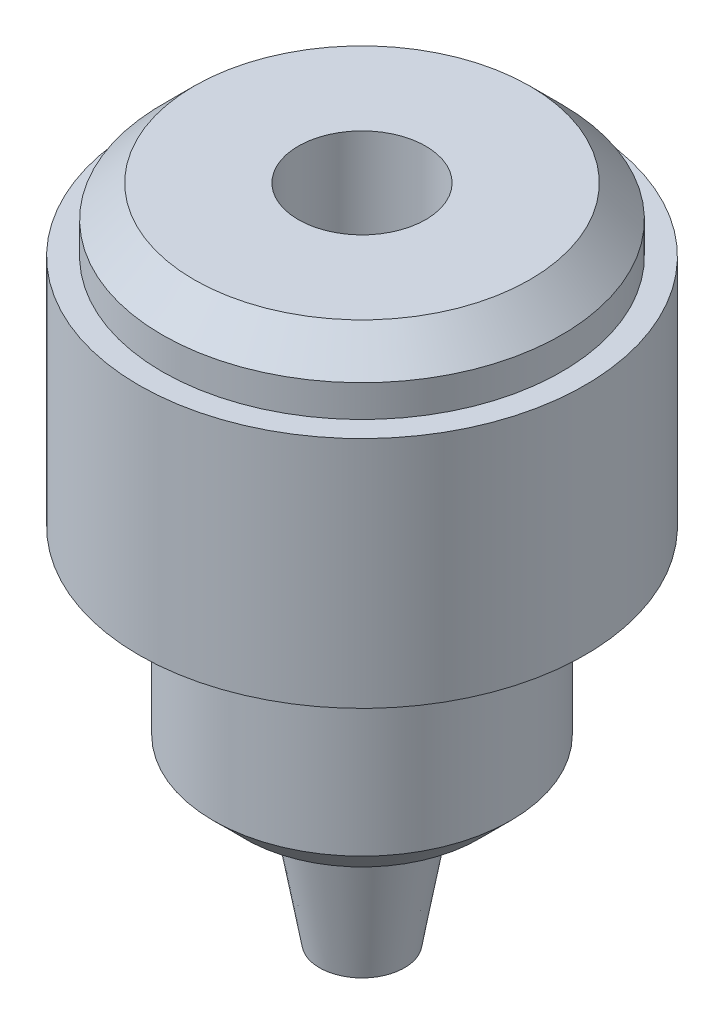
ISO-10303-21;
HEADER;
FILE_DESCRIPTION(('STEP AP214'),'2;1');
FILE_NAME('part.step','',(''),(''),'','','');
FILE_SCHEMA(('AUTOMOTIVE_DESIGN { 1 0 10303 214 1 1 1 1 }'));
ENDSEC;
DATA;
#1=APPLICATION_CONTEXT('core data for automotive mechanical design processes');
#2=APPLICATION_PROTOCOL_DEFINITION('international standard','automotive_design',2000,#1);
#3=PRODUCT_CONTEXT('',#1,'mechanical');
#4=PRODUCT('Part','Part','',(#3));
#5=PRODUCT_RELATED_PRODUCT_CATEGORY('part','',(#4));
#6=PRODUCT_DEFINITION_FORMATION('','',#4);
#7=PRODUCT_DEFINITION_CONTEXT('part definition',#1,'design');
#8=PRODUCT_DEFINITION('design','',#6,#7);
#9=PRODUCT_DEFINITION_SHAPE('','',#8);
#10=(LENGTH_UNIT() NAMED_UNIT(*) SI_UNIT(.MILLI.,.METRE.));
#11=(NAMED_UNIT(*) PLANE_ANGLE_UNIT() SI_UNIT($,.RADIAN.));
#12=(NAMED_UNIT(*) SI_UNIT($,.STERADIAN.) SOLID_ANGLE_UNIT());
#13=UNCERTAINTY_MEASURE_WITH_UNIT(LENGTH_MEASURE(1.E-05),#10,'distance_accuracy_value','');
#14=(GEOMETRIC_REPRESENTATION_CONTEXT(3) GLOBAL_UNCERTAINTY_ASSIGNED_CONTEXT((#13)) GLOBAL_UNIT_ASSIGNED_CONTEXT((#10,
#11,#12)) REPRESENTATION_CONTEXT('',''));
#15=CARTESIAN_POINT('',(0.,0.,0.));
#16=DIRECTION('',(0.,0.,1.));
#17=DIRECTION('',(1.,0.,0.));
#18=AXIS2_PLACEMENT_3D('',#15,#16,#17);
#19=CARTESIAN_POINT('',(0.,-11.,0.));
#20=DIRECTION('',(0.,-1.,0.));
#21=DIRECTION('',(0.,0.,-1.));
#22=AXIS2_PLACEMENT_3D('',#19,#20,#21);
#23=CYLINDRICAL_SURFACE('',#22,7.);
#24=CARTESIAN_POINT('',(0.,-19.5,0.));
#25=DIRECTION('',(0.,-1.,0.));
#26=DIRECTION('',(0.,0.,-1.));
#27=AXIS2_PLACEMENT_3D('',#24,#25,#26);
#28=CIRCLE('',#27,7.);
#29=CARTESIAN_POINT('',(0.,-19.5,-7.));
#30=VERTEX_POINT('',#29);
#31=EDGE_CURVE('E10',#30,#30,#28,.F.);
#32=ORIENTED_EDGE('',*,*,#31,.T.);
#33=EDGE_LOOP('',(#32));
#34=FACE_BOUND('',#33,.T.);
#35=CARTESIAN_POINT('',(0.,-11.,0.));
#36=DIRECTION('',(0.,-1.,0.));
#37=DIRECTION('',(0.,0.,-1.));
#38=AXIS2_PLACEMENT_3D('',#35,#36,#37);
#39=CIRCLE('',#38,7.);
#40=CARTESIAN_POINT('',(0.,-11.,-7.));
#41=VERTEX_POINT('',#40);
#42=EDGE_CURVE('E68',#41,#41,#39,.T.);
#43=ORIENTED_EDGE('',*,*,#42,.T.);
#44=EDGE_LOOP('',(#43));
#45=FACE_BOUND('',#44,.T.);
#46=ADVANCED_FACE('F33',(#34,#45),#23,.T.);
#47=CARTESIAN_POINT('',(0.,-28.,0.));
#48=DIRECTION('',(0.,1.,0.));
#49=DIRECTION('',(0.,0.,1.));
#50=AXIS2_PLACEMENT_3D('',#47,#48,#49);
#51=CYLINDRICAL_SURFACE('',#50,10.5);
#52=CARTESIAN_POINT('',(0.,0.,0.));
#53=DIRECTION('',(0.,1.,0.));
#54=DIRECTION('',(0.,0.,1.));
#55=AXIS2_PLACEMENT_3D('',#52,#53,#54);
#56=CIRCLE('',#55,10.5);
#57=CARTESIAN_POINT('',(0.,0.,10.5));
#58=VERTEX_POINT('',#57);
#59=EDGE_CURVE('E53',#58,#58,#56,.T.);
#60=ORIENTED_EDGE('',*,*,#59,.F.);
#61=EDGE_LOOP('',(#60));
#62=FACE_BOUND('',#61,.T.);
#63=CARTESIAN_POINT('',(0.,-11.,0.));
#64=DIRECTION('',(0.,-1.,0.));
#65=DIRECTION('',(0.,0.,-1.));
#66=AXIS2_PLACEMENT_3D('',#63,#64,#65);
#67=CIRCLE('',#66,10.5);
#68=CARTESIAN_POINT('',(0.,-11.,-10.5));
#69=VERTEX_POINT('',#68);
#70=EDGE_CURVE('E63',#69,#69,#67,.T.);
#71=ORIENTED_EDGE('',*,*,#70,.F.);
#72=EDGE_LOOP('',(#71));
#73=FACE_BOUND('',#72,.T.);
#74=ADVANCED_FACE('F95',(#62,#73),#51,.T.);
#75=CARTESIAN_POINT('',(0.,0.,0.));
#76=DIRECTION('',(0.,1.,0.));
#77=DIRECTION('',(0.,0.,1.));
#78=AXIS2_PLACEMENT_3D('',#75,#76,#77);
#79=PLANE('',#78);
#80=CARTESIAN_POINT('',(0.,0.,0.));
#81=DIRECTION('',(0.,1.,0.));
#82=DIRECTION('',(0.,0.,1.));
#83=AXIS2_PLACEMENT_3D('',#80,#81,#82);
#84=CIRCLE('',#83,9.4);
#85=CARTESIAN_POINT('',(0.,0.,9.4));
#86=VERTEX_POINT('',#85);
#87=EDGE_CURVE('E56',#86,#86,#84,.T.);
#88=ORIENTED_EDGE('',*,*,#87,.F.);
#89=EDGE_LOOP('',(#88));
#90=FACE_BOUND('',#89,.T.);
#91=ORIENTED_EDGE('',*,*,#59,.T.);
#92=EDGE_LOOP('',(#91));
#93=FACE_BOUND('',#92,.T.);
#94=ADVANCED_FACE('F99',(#90,#93),#79,.T.);
#95=CARTESIAN_POINT('',(0.,3.,0.));
#96=DIRECTION('',(0.,-1.,0.));
#97=DIRECTION('',(0.,0.,-1.));
#98=AXIS2_PLACEMENT_3D('',#95,#96,#97);
#99=CYLINDRICAL_SURFACE('',#98,9.4);
#100=CARTESIAN_POINT('',(0.,1.50000000000001,0.));
#101=DIRECTION('',(0.,1.,0.));
#102=DIRECTION('',(0.,0.,1.));
#103=AXIS2_PLACEMENT_3D('',#100,#101,#102);
#104=CIRCLE('',#103,9.4);
#105=CARTESIAN_POINT('',(0.,1.50000000000001,9.4));
#106=VERTEX_POINT('',#105);
#107=EDGE_CURVE('E45',#106,#106,#104,.F.);
#108=ORIENTED_EDGE('',*,*,#107,.T.);
#109=EDGE_LOOP('',(#108));
#110=FACE_BOUND('',#109,.T.);
#111=ORIENTED_EDGE('',*,*,#87,.T.);
#112=EDGE_LOOP('',(#111));
#113=FACE_BOUND('',#112,.T.);
#114=ADVANCED_FACE('F115',(#110,#113),#99,.T.);
#115=CARTESIAN_POINT('',(0.,3.,0.));
#116=DIRECTION('',(0.,1.,0.));
#117=DIRECTION('',(0.,0.,1.));
#118=AXIS2_PLACEMENT_3D('',#115,#116,#117);
#119=PLANE('',#118);
#120=CARTESIAN_POINT('',(0.,3.,0.));
#121=DIRECTION('',(0.,1.,0.));
#122=DIRECTION('',(0.,0.,1.));
#123=AXIS2_PLACEMENT_3D('',#120,#121,#122);
#124=CIRCLE('',#123,3.);
#125=CARTESIAN_POINT('',(0.,3.,3.));
#126=VERTEX_POINT('',#125);
#127=EDGE_CURVE('E60',#126,#126,#124,.T.);
#128=ORIENTED_EDGE('',*,*,#127,.F.);
#129=EDGE_LOOP('',(#128));
#130=FACE_BOUND('',#129,.T.);
#131=CARTESIAN_POINT('',(0.,3.,0.));
#132=DIRECTION('',(0.,1.,0.));
#133=DIRECTION('',(0.,0.,1.));
#134=AXIS2_PLACEMENT_3D('',#131,#132,#133);
#135=CIRCLE('',#134,7.90000000000001);
#136=CARTESIAN_POINT('',(0.,3.,7.90000000000001));
#137=VERTEX_POINT('',#136);
#138=EDGE_CURVE('E50',#137,#137,#135,.T.);
#139=ORIENTED_EDGE('',*,*,#138,.T.);
#140=EDGE_LOOP('',(#139));
#141=FACE_BOUND('',#140,.T.);
#142=ADVANCED_FACE('F112',(#130,#141),#119,.T.);
#143=CARTESIAN_POINT('',(0.,3.,0.));
#144=DIRECTION('',(0.,-1.,0.));
#145=DIRECTION('',(0.,0.,-1.));
#146=AXIS2_PLACEMENT_3D('',#143,#144,#145);
#147=CONICAL_SURFACE('',#146,7.90000000000001,0.785398163397447);
#148=ORIENTED_EDGE('',*,*,#107,.F.);
#149=EDGE_LOOP('',(#148));
#150=FACE_BOUND('',#149,.T.);
#151=ORIENTED_EDGE('',*,*,#138,.F.);
#152=EDGE_LOOP('',(#151));
#153=FACE_BOUND('',#152,.T.);
#154=ADVANCED_FACE('F110',(#150,#153),#147,.T.);
#155=CARTESIAN_POINT('',(0.,-11.,0.));
#156=DIRECTION('',(0.,1.,0.));
#157=DIRECTION('',(0.,0.,1.));
#158=AXIS2_PLACEMENT_3D('',#155,#156,#157);
#159=CYLINDRICAL_SURFACE('',#158,3.);
#160=CARTESIAN_POINT('',(0.,-11.,0.));
#161=DIRECTION('',(0.,1.,0.));
#162=DIRECTION('',(0.,0.,1.));
#163=AXIS2_PLACEMENT_3D('',#160,#161,#162);
#164=CIRCLE('',#163,3.);
#165=CARTESIAN_POINT('',(0.,-11.,3.));
#166=VERTEX_POINT('',#165);
#167=EDGE_CURVE('E59',#166,#166,#164,.T.);
#168=ORIENTED_EDGE('',*,*,#167,.F.);
#169=EDGE_LOOP('',(#168));
#170=FACE_BOUND('',#169,.T.);
#171=ORIENTED_EDGE('',*,*,#127,.T.);
#172=EDGE_LOOP('',(#171));
#173=FACE_BOUND('',#172,.T.);
#174=ADVANCED_FACE('F106',(#170,#173),#159,.F.);
#175=CARTESIAN_POINT('',(0.,-11.,0.));
#176=DIRECTION('',(0.,1.,0.));
#177=DIRECTION('',(0.,0.,1.));
#178=AXIS2_PLACEMENT_3D('',#175,#176,#177);
#179=PLANE('',#178);
#180=ORIENTED_EDGE('',*,*,#167,.T.);
#181=EDGE_LOOP('',(#180));
#182=FACE_BOUND('',#181,.T.);
#183=ADVANCED_FACE('F90',(#182),#179,.T.);
#184=CARTESIAN_POINT('',(0.,-11.,0.));
#185=DIRECTION('',(0.,-1.,0.));
#186=DIRECTION('',(0.,0.,-1.));
#187=AXIS2_PLACEMENT_3D('',#184,#185,#186);
#188=PLANE('',#187);
#189=ORIENTED_EDGE('',*,*,#42,.F.);
#190=EDGE_LOOP('',(#189));
#191=FACE_BOUND('',#190,.T.);
#192=ORIENTED_EDGE('',*,*,#70,.T.);
#193=EDGE_LOOP('',(#192));
#194=FACE_BOUND('',#193,.T.);
#195=ADVANCED_FACE('F82',(#191,#194),#188,.T.);
#196=CARTESIAN_POINT('',(0.,-21.,0.));
#197=DIRECTION('',(0.,-1.,0.));
#198=DIRECTION('',(0.,0.,-1.));
#199=AXIS2_PLACEMENT_3D('',#196,#197,#198);
#200=PLANE('',#199);
#201=CARTESIAN_POINT('',(0.,-21.,0.));
#202=DIRECTION('',(0.,-1.,0.));
#203=DIRECTION('',(0.,0.,-1.));
#204=AXIS2_PLACEMENT_3D('',#201,#202,#203);
#205=CIRCLE('',#204,5.5);
#206=CARTESIAN_POINT('',(0.,-21.,-5.5));
#207=VERTEX_POINT('',#206);
#208=EDGE_CURVE('E41',#207,#207,#205,.T.);
#209=ORIENTED_EDGE('',*,*,#208,.T.);
#210=EDGE_LOOP('',(#209));
#211=FACE_BOUND('',#210,.T.);
#212=CARTESIAN_POINT('',(0.,-21.,0.));
#213=DIRECTION('',(0.,-1.,0.));
#214=DIRECTION('',(0.,0.,-1.));
#215=AXIS2_PLACEMENT_3D('',#212,#213,#214);
#216=CIRCLE('',#215,3.23428886495926);
#217=CARTESIAN_POINT('',(0.,-21.,-3.23428886495926));
#218=VERTEX_POINT('',#217);
#219=EDGE_CURVE('E37',#218,#218,#216,.T.);
#220=ORIENTED_EDGE('',*,*,#219,.F.);
#221=EDGE_LOOP('',(#220));
#222=FACE_BOUND('',#221,.T.);
#223=ADVANCED_FACE('F80',(#211,#222),#200,.T.);
#224=CARTESIAN_POINT('',(0.,-28.,0.));
#225=DIRECTION('',(0.,1.,0.));
#226=DIRECTION('',(0.,0.,-1.));
#227=AXIS2_PLACEMENT_3D('',#224,#225,#226);
#228=CONICAL_SURFACE('',#227,2.,0.174532925199433);
#229=ORIENTED_EDGE('',*,*,#219,.T.);
#230=EDGE_LOOP('',(#229));
#231=FACE_BOUND('',#230,.T.);
#232=CARTESIAN_POINT('',(0.,-28.,0.));
#233=DIRECTION('',(0.,-1.,0.));
#234=DIRECTION('',(0.,0.,-1.));
#235=AXIS2_PLACEMENT_3D('',#232,#233,#234);
#236=CIRCLE('',#235,2.);
#237=CARTESIAN_POINT('',(0.,-28.,-2.));
#238=VERTEX_POINT('',#237);
#239=EDGE_CURVE('E71',#238,#238,#236,.T.);
#240=ORIENTED_EDGE('',*,*,#239,.F.);
#241=EDGE_LOOP('',(#240));
#242=FACE_BOUND('',#241,.T.);
#243=ADVANCED_FACE('F35',(#231,#242),#228,.T.);
#244=CARTESIAN_POINT('',(0.,-28.,0.));
#245=DIRECTION('',(0.,1.,0.));
#246=DIRECTION('',(0.,0.,1.));
#247=AXIS2_PLACEMENT_3D('',#244,#245,#246);
#248=PLANE('',#247);
#249=ORIENTED_EDGE('',*,*,#239,.T.);
#250=EDGE_LOOP('',(#249));
#251=FACE_BOUND('',#250,.T.);
#252=ADVANCED_FACE('F89',(#251),#248,.F.);
#253=CARTESIAN_POINT('',(0.,-21.,0.));
#254=DIRECTION('',(0.,1.,0.));
#255=DIRECTION('',(0.,0.,1.));
#256=AXIS2_PLACEMENT_3D('',#253,#254,#255);
#257=CONICAL_SURFACE('',#256,5.5,0.785398163397447);
#258=ORIENTED_EDGE('',*,*,#31,.F.);
#259=EDGE_LOOP('',(#258));
#260=FACE_BOUND('',#259,.T.);
#261=ORIENTED_EDGE('',*,*,#208,.F.);
#262=EDGE_LOOP('',(#261));
#263=FACE_BOUND('',#262,.T.);
#264=ADVANCED_FACE('F122',(#260,#263),#257,.T.);
#265=CLOSED_SHELL('',(#46,#74,#94,#114,#142,#154,#174,#183,#195,#223,#243,#252,#264));
#266=MANIFOLD_SOLID_BREP('B2',#265);
#267=ADVANCED_BREP_SHAPE_REPRESENTATION('',(#18,#266),#14);
#268=SHAPE_DEFINITION_REPRESENTATION(#9,#267);
ENDSEC;
END-ISO-10303-21;
